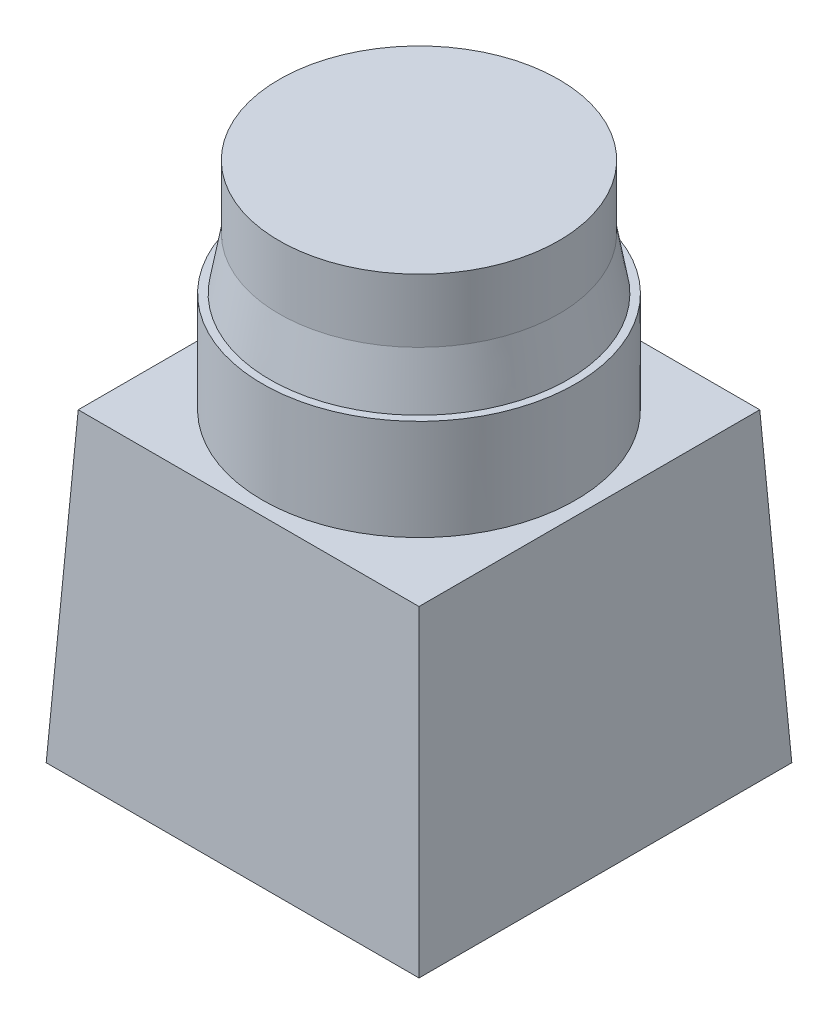
ISO-10303-21;
HEADER;
FILE_DESCRIPTION(('STEP AP214'),'2;1');
FILE_NAME('part.step','',(''),(''),'','','');
FILE_SCHEMA(('AUTOMOTIVE_DESIGN { 1 0 10303 214 1 1 1 1 }'));
ENDSEC;
DATA;
#1=APPLICATION_CONTEXT('core data for automotive mechanical design processes');
#2=APPLICATION_PROTOCOL_DEFINITION('international standard','automotive_design',2000,#1);
#3=PRODUCT_CONTEXT('',#1,'mechanical');
#4=PRODUCT('Part','Part','',(#3));
#5=PRODUCT_RELATED_PRODUCT_CATEGORY('part','',(#4));
#6=PRODUCT_DEFINITION_FORMATION('','',#4);
#7=PRODUCT_DEFINITION_CONTEXT('part definition',#1,'design');
#8=PRODUCT_DEFINITION('design','',#6,#7);
#9=PRODUCT_DEFINITION_SHAPE('','',#8);
#10=(LENGTH_UNIT() NAMED_UNIT(*) SI_UNIT(.MILLI.,.METRE.));
#11=(NAMED_UNIT(*) PLANE_ANGLE_UNIT() SI_UNIT($,.RADIAN.));
#12=(NAMED_UNIT(*) SI_UNIT($,.STERADIAN.) SOLID_ANGLE_UNIT());
#13=UNCERTAINTY_MEASURE_WITH_UNIT(LENGTH_MEASURE(1.E-05),#10,'distance_accuracy_value','');
#14=(GEOMETRIC_REPRESENTATION_CONTEXT(3) GLOBAL_UNCERTAINTY_ASSIGNED_CONTEXT((#13)) GLOBAL_UNIT_ASSIGNED_CONTEXT((#10,
#11,#12)) REPRESENTATION_CONTEXT('',''));
#15=CARTESIAN_POINT('',(0.,0.,0.));
#16=DIRECTION('',(0.,0.,1.));
#17=DIRECTION('',(1.,0.,0.));
#18=AXIS2_PLACEMENT_3D('',#15,#16,#17);
#19=CARTESIAN_POINT('',(25.,0.,-25.));
#20=DIRECTION('',(0.998629534754574,0.0523359562429439,0.));
#21=DIRECTION('',(-0.0523359562429439,0.998629534754574,0.));
#22=AXIS2_PLACEMENT_3D('',#19,#20,#21);
#23=PLANE('',#22);
#24=DIRECTION('',(0.,0.,-1.));
#25=VECTOR('',#24,1.);
#26=CARTESIAN_POINT('',(25.,0.,-25.));
#27=LINE('',#26,#25);
#28=CARTESIAN_POINT('',(25.,0.,25.));
#29=VERTEX_POINT('',#28);
#30=CARTESIAN_POINT('',(25.,0.,-25.));
#31=VERTEX_POINT('',#30);
#32=EDGE_CURVE('E81',#29,#31,#27,.T.);
#33=ORIENTED_EDGE('',*,*,#32,.T.);
#34=DIRECTION('',(0.052264427688714,-0.997264688634237,-0.052264427688714));
#35=VECTOR('',#34,1.);
#36=CARTESIAN_POINT('',(24.8634214799186,2.6060734102816,-24.8634214799186));
#37=LINE('',#36,#35);
#38=CARTESIAN_POINT('',(22.8512810493953,41.,-22.8512810493953));
#39=VERTEX_POINT('',#38);
#40=EDGE_CURVE('E43',#39,#31,#37,.T.);
#41=ORIENTED_EDGE('',*,*,#40,.F.);
#42=DIRECTION('',(0.,0.,1.));
#43=VECTOR('',#42,1.);
#44=CARTESIAN_POINT('',(22.8512810493953,41.,-25.));
#45=LINE('',#44,#43);
#46=CARTESIAN_POINT('',(22.8512810493953,41.,22.8512810493953));
#47=VERTEX_POINT('',#46);
#48=EDGE_CURVE('E104',#47,#39,#45,.F.);
#49=ORIENTED_EDGE('',*,*,#48,.F.);
#50=DIRECTION('',(0.052264427688714,-0.997264688634237,0.052264427688714));
#51=VECTOR('',#50,1.);
#52=CARTESIAN_POINT('',(24.8634214799186,2.6060734102816,24.8634214799186));
#53=LINE('',#52,#51);
#54=EDGE_CURVE('E94',#47,#29,#53,.T.);
#55=ORIENTED_EDGE('',*,*,#54,.T.);
#56=EDGE_LOOP('',(#33,#41,#49,#55));
#57=FACE_BOUND('',#56,.T.);
#58=ADVANCED_FACE('F35',(#57),#23,.T.);
#59=CARTESIAN_POINT('',(-25.,0.,-25.));
#60=DIRECTION('',(0.,0.0523359562429439,-0.998629534754574));
#61=DIRECTION('',(0.,0.998629534754574,0.0523359562429439));
#62=AXIS2_PLACEMENT_3D('',#59,#60,#61);
#63=PLANE('',#62);
#64=DIRECTION('',(-1.,0.,0.));
#65=VECTOR('',#64,1.);
#66=CARTESIAN_POINT('',(-25.,0.,-25.));
#67=LINE('',#66,#65);
#68=CARTESIAN_POINT('',(-25.,0.,-25.));
#69=VERTEX_POINT('',#68);
#70=EDGE_CURVE('E76',#31,#69,#67,.T.);
#71=ORIENTED_EDGE('',*,*,#70,.T.);
#72=DIRECTION('',(-0.052264427688714,-0.997264688634237,-0.052264427688714));
#73=VECTOR('',#72,1.);
#74=CARTESIAN_POINT('',(-25.,0.,-25.));
#75=LINE('',#74,#73);
#76=CARTESIAN_POINT('',(-22.8512810493953,41.,-22.8512810493953));
#77=VERTEX_POINT('',#76);
#78=EDGE_CURVE('E91',#77,#69,#75,.T.);
#79=ORIENTED_EDGE('',*,*,#78,.F.);
#80=DIRECTION('',(1.,0.,0.));
#81=VECTOR('',#80,1.);
#82=CARTESIAN_POINT('',(-25.,41.,-22.8512810493953));
#83=LINE('',#82,#81);
#84=EDGE_CURVE('E88',#39,#77,#83,.F.);
#85=ORIENTED_EDGE('',*,*,#84,.F.);
#86=ORIENTED_EDGE('',*,*,#40,.T.);
#87=EDGE_LOOP('',(#71,#79,#85,#86));
#88=FACE_BOUND('',#87,.T.);
#89=ADVANCED_FACE('F37',(#88),#63,.T.);
#90=CARTESIAN_POINT('',(-25.,0.,-25.));
#91=DIRECTION('',(-0.998629534754574,0.0523359562429439,0.));
#92=DIRECTION('',(-0.0523359562429439,-0.998629534754574,0.));
#93=AXIS2_PLACEMENT_3D('',#90,#91,#92);
#94=PLANE('',#93);
#95=DIRECTION('',(0.,0.,1.));
#96=VECTOR('',#95,1.);
#97=CARTESIAN_POINT('',(-25.,0.,-25.));
#98=LINE('',#97,#96);
#99=CARTESIAN_POINT('',(-25.,0.,25.));
#100=VERTEX_POINT('',#99);
#101=EDGE_CURVE('E82',#69,#100,#98,.T.);
#102=ORIENTED_EDGE('',*,*,#101,.T.);
#103=DIRECTION('',(-0.052264427688714,-0.997264688634237,0.052264427688714));
#104=VECTOR('',#103,1.);
#105=CARTESIAN_POINT('',(-25.,0.,25.));
#106=LINE('',#105,#104);
#107=CARTESIAN_POINT('',(-22.8512810493953,41.,22.8512810493953));
#108=VERTEX_POINT('',#107);
#109=EDGE_CURVE('E107',#108,#100,#106,.T.);
#110=ORIENTED_EDGE('',*,*,#109,.F.);
#111=DIRECTION('',(0.,0.,-1.));
#112=VECTOR('',#111,1.);
#113=CARTESIAN_POINT('',(-22.8512810493953,41.,-25.));
#114=LINE('',#113,#112);
#115=EDGE_CURVE('E55',#77,#108,#114,.F.);
#116=ORIENTED_EDGE('',*,*,#115,.F.);
#117=ORIENTED_EDGE('',*,*,#78,.T.);
#118=EDGE_LOOP('',(#102,#110,#116,#117));
#119=FACE_BOUND('',#118,.T.);
#120=ADVANCED_FACE('F115',(#119),#94,.T.);
#121=CARTESIAN_POINT('',(-25.,0.,25.));
#122=DIRECTION('',(0.,0.0523359562429439,0.998629534754574));
#123=DIRECTION('',(0.,-0.998629534754574,0.0523359562429439));
#124=AXIS2_PLACEMENT_3D('',#121,#122,#123);
#125=PLANE('',#124);
#126=DIRECTION('',(1.,0.,0.));
#127=VECTOR('',#126,1.);
#128=CARTESIAN_POINT('',(-25.,0.,25.));
#129=LINE('',#128,#127);
#130=EDGE_CURVE('E103',#100,#29,#129,.T.);
#131=ORIENTED_EDGE('',*,*,#130,.T.);
#132=ORIENTED_EDGE('',*,*,#54,.F.);
#133=DIRECTION('',(-1.,0.,0.));
#134=VECTOR('',#133,1.);
#135=CARTESIAN_POINT('',(-25.,41.,22.8512810493953));
#136=LINE('',#135,#134);
#137=EDGE_CURVE('E50',#108,#47,#136,.F.);
#138=ORIENTED_EDGE('',*,*,#137,.F.);
#139=ORIENTED_EDGE('',*,*,#109,.T.);
#140=EDGE_LOOP('',(#131,#132,#138,#139));
#141=FACE_BOUND('',#140,.T.);
#142=ADVANCED_FACE('F117',(#141),#125,.T.);
#143=CARTESIAN_POINT('',(0.,41.,0.));
#144=DIRECTION('',(0.,1.,0.));
#145=DIRECTION('',(0.,0.,1.));
#146=AXIS2_PLACEMENT_3D('',#143,#144,#145);
#147=PLANE('',#146);
#148=CARTESIAN_POINT('',(0.,41.,0.));
#149=DIRECTION('',(0.,1.,0.));
#150=DIRECTION('',(0.,0.,1.));
#151=AXIS2_PLACEMENT_3D('',#148,#149,#150);
#152=CIRCLE('',#151,21.);
#153=CARTESIAN_POINT('',(0.,41.,21.));
#154=VERTEX_POINT('',#153);
#155=EDGE_CURVE('E11',#154,#154,#152,.T.);
#156=ORIENTED_EDGE('',*,*,#155,.F.);
#157=EDGE_LOOP('',(#156));
#158=FACE_BOUND('',#157,.T.);
#159=ORIENTED_EDGE('',*,*,#48,.T.);
#160=ORIENTED_EDGE('',*,*,#84,.T.);
#161=ORIENTED_EDGE('',*,*,#115,.T.);
#162=ORIENTED_EDGE('',*,*,#137,.T.);
#163=EDGE_LOOP('',(#159,#160,#161,#162));
#164=FACE_BOUND('',#163,.T.);
#165=ADVANCED_FACE('F113',(#158,#164),#147,.T.);
#166=CARTESIAN_POINT('',(0.,0.,0.));
#167=DIRECTION('',(0.,1.,0.));
#168=DIRECTION('',(0.,0.,1.));
#169=AXIS2_PLACEMENT_3D('',#166,#167,#168);
#170=PLANE('',#169);
#171=ORIENTED_EDGE('',*,*,#32,.F.);
#172=ORIENTED_EDGE('',*,*,#130,.F.);
#173=ORIENTED_EDGE('',*,*,#101,.F.);
#174=ORIENTED_EDGE('',*,*,#70,.F.);
#175=EDGE_LOOP('',(#171,#172,#173,#174));
#176=FACE_BOUND('',#175,.T.);
#177=ADVANCED_FACE('F78',(#176),#170,.F.);
#178=CARTESIAN_POINT('',(0.,41.,0.));
#179=DIRECTION('',(0.,-1.,0.));
#180=DIRECTION('',(0.,0.,-1.));
#181=AXIS2_PLACEMENT_3D('',#178,#179,#180);
#182=CYLINDRICAL_SURFACE('',#181,21.);
#183=CARTESIAN_POINT('',(0.,54.5,0.));
#184=DIRECTION('',(0.,-1.,0.));
#185=DIRECTION('',(0.,0.,-1.));
#186=AXIS2_PLACEMENT_3D('',#183,#184,#185);
#187=CIRCLE('',#186,21.);
#188=CARTESIAN_POINT('',(0.,54.5,-21.));
#189=VERTEX_POINT('',#188);
#190=EDGE_CURVE('E95',#189,#189,#187,.T.);
#191=ORIENTED_EDGE('',*,*,#190,.T.);
#192=EDGE_LOOP('',(#191));
#193=FACE_BOUND('',#192,.T.);
#194=ORIENTED_EDGE('',*,*,#155,.T.);
#195=EDGE_LOOP('',(#194));
#196=FACE_BOUND('',#195,.T.);
#197=ADVANCED_FACE('F133',(#193,#196),#182,.T.);
#198=CARTESIAN_POINT('',(0.,54.5,-3.78169717762946E-13));
#199=DIRECTION('',(0.,-1.,0.));
#200=DIRECTION('',(0.,0.,-1.));
#201=AXIS2_PLACEMENT_3D('',#198,#199,#200);
#202=PLANE('',#201);
#203=ORIENTED_EDGE('',*,*,#190,.F.);
#204=EDGE_LOOP('',(#203));
#205=FACE_BOUND('',#204,.T.);
#206=CARTESIAN_POINT('',(0.,54.5,0.));
#207=DIRECTION('',(0.,-1.,0.));
#208=DIRECTION('',(0.,0.,-1.));
#209=AXIS2_PLACEMENT_3D('',#206,#207,#208);
#210=CIRCLE('',#209,20.);
#211=CARTESIAN_POINT('',(0.,54.5,-20.));
#212=VERTEX_POINT('',#211);
#213=EDGE_CURVE('E98',#212,#212,#210,.T.);
#214=ORIENTED_EDGE('',*,*,#213,.T.);
#215=EDGE_LOOP('',(#214));
#216=FACE_BOUND('',#215,.T.);
#217=ADVANCED_FACE('F137',(#205,#216),#202,.F.);
#218=CARTESIAN_POINT('',(0.,61.5,0.));
#219=DIRECTION('',(0.,-1.,0.));
#220=DIRECTION('',(0.,0.,-1.));
#221=AXIS2_PLACEMENT_3D('',#218,#219,#220);
#222=CONICAL_SURFACE('',#221,18.75,0.176708856070038);
#223=ORIENTED_EDGE('',*,*,#213,.F.);
#224=EDGE_LOOP('',(#223));
#225=FACE_BOUND('',#224,.T.);
#226=CARTESIAN_POINT('',(0.,61.5,0.));
#227=DIRECTION('',(0.,-1.,0.));
#228=DIRECTION('',(0.,0.,-1.));
#229=AXIS2_PLACEMENT_3D('',#226,#227,#228);
#230=CIRCLE('',#229,18.75);
#231=CARTESIAN_POINT('',(0.,61.5,-18.75));
#232=VERTEX_POINT('',#231);
#233=EDGE_CURVE('E159',#232,#232,#230,.T.);
#234=ORIENTED_EDGE('',*,*,#233,.T.);
#235=EDGE_LOOP('',(#234));
#236=FACE_BOUND('',#235,.T.);
#237=ADVANCED_FACE('F141',(#225,#236),#222,.T.);
#238=CARTESIAN_POINT('',(0.,41.,0.));
#239=DIRECTION('',(0.,-1.,0.));
#240=DIRECTION('',(0.,0.,-1.));
#241=AXIS2_PLACEMENT_3D('',#238,#239,#240);
#242=CYLINDRICAL_SURFACE('',#241,18.75);
#243=ORIENTED_EDGE('',*,*,#233,.F.);
#244=EDGE_LOOP('',(#243));
#245=FACE_BOUND('',#244,.T.);
#246=CARTESIAN_POINT('',(0.,70.,0.));
#247=DIRECTION('',(0.,-1.,0.));
#248=DIRECTION('',(0.,0.,-1.));
#249=AXIS2_PLACEMENT_3D('',#246,#247,#248);
#250=CIRCLE('',#249,18.75);
#251=CARTESIAN_POINT('',(0.,70.,-18.75));
#252=VERTEX_POINT('',#251);
#253=EDGE_CURVE('E157',#252,#252,#250,.T.);
#254=ORIENTED_EDGE('',*,*,#253,.T.);
#255=EDGE_LOOP('',(#254));
#256=FACE_BOUND('',#255,.T.);
#257=ADVANCED_FACE('F145',(#245,#256),#242,.T.);
#258=CARTESIAN_POINT('',(0.,70.,0.));
#259=DIRECTION('',(0.,-1.,0.));
#260=DIRECTION('',(0.,0.,-1.));
#261=AXIS2_PLACEMENT_3D('',#258,#259,#260);
#262=PLANE('',#261);
#263=ORIENTED_EDGE('',*,*,#253,.F.);
#264=EDGE_LOOP('',(#263));
#265=FACE_BOUND('',#264,.T.);
#266=ADVANCED_FACE('F149',(#265),#262,.F.);
#267=CLOSED_SHELL('',(#58,#89,#120,#142,#165,#177,#197,#217,#237,#257,#266));
#268=MANIFOLD_SOLID_BREP('B2',#267);
#269=ADVANCED_BREP_SHAPE_REPRESENTATION('',(#18,#268),#14);
#270=SHAPE_DEFINITION_REPRESENTATION(#9,#269);
ENDSEC;
END-ISO-10303-21;
